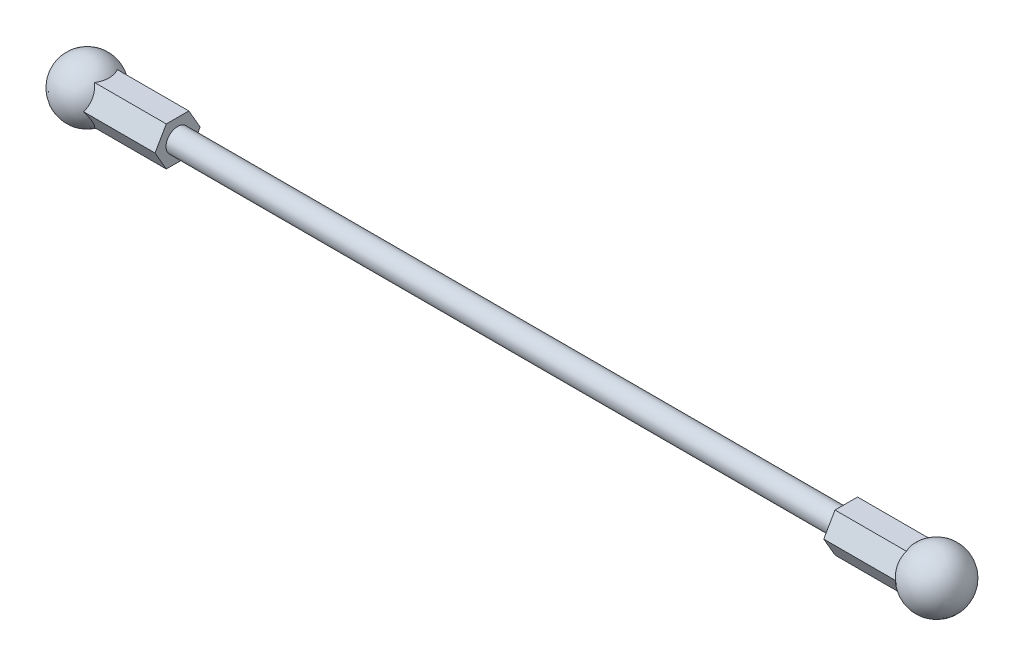
ISO-10303-21;
HEADER;
FILE_DESCRIPTION(('STEP AP214'),'2;1');
FILE_NAME('part.step','',(''),(''),'','','');
FILE_SCHEMA(('AUTOMOTIVE_DESIGN { 1 0 10303 214 1 1 1 1 }'));
ENDSEC;
DATA;
#1=APPLICATION_CONTEXT('core data for automotive mechanical design processes');
#2=APPLICATION_PROTOCOL_DEFINITION('international standard','automotive_design',2000,#1);
#3=PRODUCT_CONTEXT('',#1,'mechanical');
#4=PRODUCT('Part','Part','',(#3));
#5=PRODUCT_RELATED_PRODUCT_CATEGORY('part','',(#4));
#6=PRODUCT_DEFINITION_FORMATION('','',#4);
#7=PRODUCT_DEFINITION_CONTEXT('part definition',#1,'design');
#8=PRODUCT_DEFINITION('design','',#6,#7);
#9=PRODUCT_DEFINITION_SHAPE('','',#8);
#10=(LENGTH_UNIT() NAMED_UNIT(*) SI_UNIT(.MILLI.,.METRE.));
#11=(NAMED_UNIT(*) PLANE_ANGLE_UNIT() SI_UNIT($,.RADIAN.));
#12=(NAMED_UNIT(*) SI_UNIT($,.STERADIAN.) SOLID_ANGLE_UNIT());
#13=UNCERTAINTY_MEASURE_WITH_UNIT(LENGTH_MEASURE(1.E-05),#10,'distance_accuracy_value','');
#14=(GEOMETRIC_REPRESENTATION_CONTEXT(3) GLOBAL_UNCERTAINTY_ASSIGNED_CONTEXT((#13)) GLOBAL_UNIT_ASSIGNED_CONTEXT((#10,
#11,#12)) REPRESENTATION_CONTEXT('',''));
#15=CARTESIAN_POINT('',(0.,0.,0.));
#16=DIRECTION('',(0.,0.,1.));
#17=DIRECTION('',(1.,0.,0.));
#18=AXIS2_PLACEMENT_3D('',#15,#16,#17);
#19=CARTESIAN_POINT('',(77.75,2.,-1.15470053837925));
#20=DIRECTION('',(0.,-1.,0.));
#21=DIRECTION('',(0.,0.,-1.));
#22=AXIS2_PLACEMENT_3D('',#19,#20,#21);
#23=PLANE('',#22);
#24=DIRECTION('',(1.,0.,0.));
#25=VECTOR('',#24,1.);
#26=CARTESIAN_POINT('',(77.75,2.,-1.15470053837925));
#27=LINE('',#26,#25);
#28=CARTESIAN_POINT('',(77.75,2.,-1.15470053837925));
#29=VERTEX_POINT('',#28);
#30=CARTESIAN_POINT('',(85.0851457844873,2.,-1.15470053837925));
#31=VERTEX_POINT('',#30);
#32=EDGE_CURVE('E113',#29,#31,#27,.T.);
#33=ORIENTED_EDGE('',*,*,#32,.F.);
#34=DIRECTION('',(0.,0.,1.));
#35=VECTOR('',#34,1.);
#36=CARTESIAN_POINT('',(77.75,2.,-1.15470053837925));
#37=LINE('',#36,#35);
#38=CARTESIAN_POINT('',(77.75,2.,1.15470053837925));
#39=VERTEX_POINT('',#38);
#40=EDGE_CURVE('E103',#29,#39,#37,.T.);
#41=ORIENTED_EDGE('',*,*,#40,.T.);
#42=DIRECTION('',(1.,0.,0.));
#43=VECTOR('',#42,1.);
#44=CARTESIAN_POINT('',(77.75,2.,1.15470053837925));
#45=LINE('',#44,#43);
#46=CARTESIAN_POINT('',(85.0851457844873,2.,1.15470053837925));
#47=VERTEX_POINT('',#46);
#48=EDGE_CURVE('E67',#39,#47,#45,.T.);
#49=ORIENTED_EDGE('',*,*,#48,.T.);
#50=CARTESIAN_POINT('',(87.,2.,0.));
#51=DIRECTION('',(0.,1.,0.));
#52=DIRECTION('',(0.,0.,-1.));
#53=AXIS2_PLACEMENT_3D('',#50,#51,#52);
#54=CIRCLE('',#53,2.23606797749979);
#55=EDGE_CURVE('E12',#31,#47,#54,.T.);
#56=ORIENTED_EDGE('',*,*,#55,.F.);
#57=EDGE_LOOP('',(#33,#41,#49,#56));
#58=FACE_BOUND('',#57,.T.);
#59=ADVANCED_FACE('F49',(#58),#23,.F.);
#60=CARTESIAN_POINT('',(77.75,2.,1.15470053837925));
#61=DIRECTION('',(0.,-0.5,-0.866025403784439));
#62=DIRECTION('',(0.,0.866025403784439,-0.5));
#63=AXIS2_PLACEMENT_3D('',#60,#61,#62);
#64=PLANE('',#63);
#65=ORIENTED_EDGE('',*,*,#48,.F.);
#66=DIRECTION('',(0.,-0.866025403784438,0.5));
#67=VECTOR('',#66,1.);
#68=CARTESIAN_POINT('',(77.75,2.,1.15470053837925));
#69=LINE('',#68,#67);
#70=CARTESIAN_POINT('',(77.75,0.,2.3094010767585));
#71=VERTEX_POINT('',#70);
#72=EDGE_CURVE('E101',#39,#71,#69,.T.);
#73=ORIENTED_EDGE('',*,*,#72,.T.);
#74=DIRECTION('',(1.,0.,0.));
#75=VECTOR('',#74,1.);
#76=CARTESIAN_POINT('',(77.75,0.,2.3094010767585));
#77=LINE('',#76,#75);
#78=CARTESIAN_POINT('',(85.0851457844873,0.,2.3094010767585));
#79=VERTEX_POINT('',#78);
#80=EDGE_CURVE('E141',#71,#79,#77,.T.);
#81=ORIENTED_EDGE('',*,*,#80,.T.);
#82=CARTESIAN_POINT('',(87.,1.,1.73205080756888));
#83=DIRECTION('',(0.,0.5,0.866025403784439));
#84=DIRECTION('',(0.,0.866025403784439,-0.5));
#85=AXIS2_PLACEMENT_3D('',#82,#83,#84);
#86=CIRCLE('',#85,2.23606797749979);
#87=EDGE_CURVE('E57',#47,#79,#86,.T.);
#88=ORIENTED_EDGE('',*,*,#87,.F.);
#89=EDGE_LOOP('',(#65,#73,#81,#88));
#90=FACE_BOUND('',#89,.T.);
#91=ADVANCED_FACE('F109',(#90),#64,.F.);
#92=CARTESIAN_POINT('',(77.75,0.,2.3094010767585));
#93=DIRECTION('',(0.,0.5,-0.866025403784439));
#94=DIRECTION('',(0.,0.866025403784439,0.5));
#95=AXIS2_PLACEMENT_3D('',#92,#93,#94);
#96=PLANE('',#95);
#97=ORIENTED_EDGE('',*,*,#80,.F.);
#98=DIRECTION('',(0.,-0.866025403784439,-0.5));
#99=VECTOR('',#98,1.);
#100=CARTESIAN_POINT('',(77.75,0.,2.3094010767585));
#101=LINE('',#100,#99);
#102=CARTESIAN_POINT('',(77.75,-2.,1.15470053837925));
#103=VERTEX_POINT('',#102);
#104=EDGE_CURVE('E105',#71,#103,#101,.T.);
#105=ORIENTED_EDGE('',*,*,#104,.T.);
#106=DIRECTION('',(1.,0.,0.));
#107=VECTOR('',#106,1.);
#108=CARTESIAN_POINT('',(77.75,-2.,1.15470053837925));
#109=LINE('',#108,#107);
#110=CARTESIAN_POINT('',(85.0851457844873,-2.,1.15470053837925));
#111=VERTEX_POINT('',#110);
#112=EDGE_CURVE('E136',#103,#111,#109,.T.);
#113=ORIENTED_EDGE('',*,*,#112,.T.);
#114=CARTESIAN_POINT('',(87.,-1.,1.73205080756888));
#115=DIRECTION('',(0.,-0.5,0.866025403784439));
#116=DIRECTION('',(0.,0.866025403784439,0.5));
#117=AXIS2_PLACEMENT_3D('',#114,#115,#116);
#118=CIRCLE('',#117,2.23606797749979);
#119=EDGE_CURVE('E111',#79,#111,#118,.T.);
#120=ORIENTED_EDGE('',*,*,#119,.F.);
#121=EDGE_LOOP('',(#97,#105,#113,#120));
#122=FACE_BOUND('',#121,.T.);
#123=ADVANCED_FACE('F159',(#122),#96,.F.);
#124=CARTESIAN_POINT('',(77.75,-2.,1.15470053837925));
#125=DIRECTION('',(0.,1.,0.));
#126=DIRECTION('',(0.,0.,1.));
#127=AXIS2_PLACEMENT_3D('',#124,#125,#126);
#128=PLANE('',#127);
#129=ORIENTED_EDGE('',*,*,#112,.F.);
#130=DIRECTION('',(0.,0.,-1.));
#131=VECTOR('',#130,1.);
#132=CARTESIAN_POINT('',(77.75,-2.,1.15470053837925));
#133=LINE('',#132,#131);
#134=CARTESIAN_POINT('',(77.75,-2.,-1.15470053837925));
#135=VERTEX_POINT('',#134);
#136=EDGE_CURVE('E120',#103,#135,#133,.T.);
#137=ORIENTED_EDGE('',*,*,#136,.T.);
#138=DIRECTION('',(1.,0.,0.));
#139=VECTOR('',#138,1.);
#140=CARTESIAN_POINT('',(77.75,-2.,-1.15470053837925));
#141=LINE('',#140,#139);
#142=CARTESIAN_POINT('',(85.0851457844873,-2.,-1.15470053837925));
#143=VERTEX_POINT('',#142);
#144=EDGE_CURVE('E131',#135,#143,#141,.T.);
#145=ORIENTED_EDGE('',*,*,#144,.T.);
#146=CARTESIAN_POINT('',(87.,-2.,0.));
#147=DIRECTION('',(0.,-1.,0.));
#148=DIRECTION('',(0.,0.,1.));
#149=AXIS2_PLACEMENT_3D('',#146,#147,#148);
#150=CIRCLE('',#149,2.23606797749979);
#151=EDGE_CURVE('E138',#111,#143,#150,.T.);
#152=ORIENTED_EDGE('',*,*,#151,.F.);
#153=EDGE_LOOP('',(#129,#137,#145,#152));
#154=FACE_BOUND('',#153,.T.);
#155=ADVANCED_FACE('F157',(#154),#128,.F.);
#156=CARTESIAN_POINT('',(77.75,-2.,-1.15470053837925));
#157=DIRECTION('',(0.,0.5,0.866025403784439));
#158=DIRECTION('',(0.,-0.866025403784439,0.5));
#159=AXIS2_PLACEMENT_3D('',#156,#157,#158);
#160=PLANE('',#159);
#161=ORIENTED_EDGE('',*,*,#144,.F.);
#162=DIRECTION('',(0.,0.866025403784438,-0.5));
#163=VECTOR('',#162,1.);
#164=CARTESIAN_POINT('',(77.75,-2.,-1.15470053837925));
#165=LINE('',#164,#163);
#166=CARTESIAN_POINT('',(77.75,0.,-2.3094010767585));
#167=VERTEX_POINT('',#166);
#168=EDGE_CURVE('E123',#135,#167,#165,.T.);
#169=ORIENTED_EDGE('',*,*,#168,.T.);
#170=DIRECTION('',(1.,0.,0.));
#171=VECTOR('',#170,1.);
#172=CARTESIAN_POINT('',(77.75,0.,-2.3094010767585));
#173=LINE('',#172,#171);
#174=CARTESIAN_POINT('',(85.0851457844873,0.,-2.3094010767585));
#175=VERTEX_POINT('',#174);
#176=EDGE_CURVE('E128',#167,#175,#173,.T.);
#177=ORIENTED_EDGE('',*,*,#176,.T.);
#178=CARTESIAN_POINT('',(87.,-1.,-1.73205080756888));
#179=DIRECTION('',(0.,-0.5,-0.866025403784439));
#180=DIRECTION('',(0.,-0.866025403784439,0.5));
#181=AXIS2_PLACEMENT_3D('',#178,#179,#180);
#182=CIRCLE('',#181,2.23606797749979);
#183=EDGE_CURVE('E133',#143,#175,#182,.T.);
#184=ORIENTED_EDGE('',*,*,#183,.F.);
#185=EDGE_LOOP('',(#161,#169,#177,#184));
#186=FACE_BOUND('',#185,.T.);
#187=ADVANCED_FACE('F154',(#186),#160,.F.);
#188=CARTESIAN_POINT('',(77.75,0.,-2.3094010767585));
#189=DIRECTION('',(0.,-0.5,0.866025403784439));
#190=DIRECTION('',(0.,-0.866025403784439,-0.5));
#191=AXIS2_PLACEMENT_3D('',#188,#189,#190);
#192=PLANE('',#191);
#193=ORIENTED_EDGE('',*,*,#176,.F.);
#194=DIRECTION('',(0.,0.866025403784439,0.5));
#195=VECTOR('',#194,1.);
#196=CARTESIAN_POINT('',(77.75,0.,-2.3094010767585));
#197=LINE('',#196,#195);
#198=EDGE_CURVE('E126',#167,#29,#197,.T.);
#199=ORIENTED_EDGE('',*,*,#198,.T.);
#200=ORIENTED_EDGE('',*,*,#32,.T.);
#201=CARTESIAN_POINT('',(87.,1.,-1.73205080756888));
#202=DIRECTION('',(0.,0.5,-0.866025403784439));
#203=DIRECTION('',(0.,-0.866025403784439,-0.5));
#204=AXIS2_PLACEMENT_3D('',#201,#202,#203);
#205=CIRCLE('',#204,2.23606797749979);
#206=EDGE_CURVE('E114',#175,#31,#205,.T.);
#207=ORIENTED_EDGE('',*,*,#206,.F.);
#208=EDGE_LOOP('',(#193,#199,#200,#207));
#209=FACE_BOUND('',#208,.T.);
#210=ADVANCED_FACE('F150',(#209),#192,.F.);
#211=CARTESIAN_POINT('',(77.75,0.,0.));
#212=DIRECTION('',(-1.,0.,0.));
#213=DIRECTION('',(0.,0.,-1.));
#214=AXIS2_PLACEMENT_3D('',#211,#212,#213);
#215=PLANE('',#214);
#216=ORIENTED_EDGE('',*,*,#40,.F.);
#217=ORIENTED_EDGE('',*,*,#198,.F.);
#218=ORIENTED_EDGE('',*,*,#168,.F.);
#219=ORIENTED_EDGE('',*,*,#136,.F.);
#220=ORIENTED_EDGE('',*,*,#104,.F.);
#221=ORIENTED_EDGE('',*,*,#72,.F.);
#222=EDGE_LOOP('',(#216,#217,#218,#219,#220,#221));
#223=FACE_BOUND('',#222,.T.);
#224=ADVANCED_FACE('F102',(#223),#215,.T.);
#225=CARTESIAN_POINT('',(87.,0.,0.));
#226=DIRECTION('',(0.,1.,0.));
#227=DIRECTION('',(0.,0.,-1.));
#228=AXIS2_PLACEMENT_3D('',#225,#226,#227);
#229=SPHERICAL_SURFACE('',#228,3.);
#230=ORIENTED_EDGE('',*,*,#206,.T.);
#231=ORIENTED_EDGE('',*,*,#55,.T.);
#232=ORIENTED_EDGE('',*,*,#87,.T.);
#233=ORIENTED_EDGE('',*,*,#119,.T.);
#234=ORIENTED_EDGE('',*,*,#151,.T.);
#235=ORIENTED_EDGE('',*,*,#183,.T.);
#236=EDGE_LOOP('',(#230,#231,#232,#233,#234,#235));
#237=FACE_BOUND('',#236,.T.);
#238=ADVANCED_FACE('F51',(#237),#229,.T.);
#239=CLOSED_SHELL('',(#59,#91,#123,#155,#187,#210,#224,#238));
#240=MANIFOLD_SOLID_BREP('B2',#239);
#241=CARTESIAN_POINT('',(0.,0.,0.));
#242=DIRECTION('',(0.,1.,0.));
#243=DIRECTION('',(-1.,0.,0.));
#244=AXIS2_PLACEMENT_3D('',#241,#242,#243);
#245=SPHERICAL_SURFACE('',#244,3.);
#246=CARTESIAN_POINT('',(0.,2.,0.));
#247=DIRECTION('',(0.,-1.,0.));
#248=DIRECTION('',(0.,0.,-1.));
#249=AXIS2_PLACEMENT_3D('',#246,#247,#248);
#250=CIRCLE('',#249,2.23606797749979);
#251=CARTESIAN_POINT('',(1.91485421551268,2.,-1.15470053837925));
#252=VERTEX_POINT('',#251);
#253=CARTESIAN_POINT('',(1.91485421551268,2.,1.15470053837925));
#254=VERTEX_POINT('',#253);
#255=EDGE_CURVE('E47',#252,#254,#250,.T.);
#256=ORIENTED_EDGE('',*,*,#255,.F.);
#257=CARTESIAN_POINT('',(0.,1.,-1.73205080756888));
#258=DIRECTION('',(0.,-0.5,0.866025403784439));
#259=DIRECTION('',(0.,-0.866025403784439,-0.5));
#260=AXIS2_PLACEMENT_3D('',#257,#258,#259);
#261=CIRCLE('',#260,2.23606797749979);
#262=CARTESIAN_POINT('',(1.91485421551268,0.,-2.3094010767585));
#263=VERTEX_POINT('',#262);
#264=EDGE_CURVE('E295',#263,#252,#261,.T.);
#265=ORIENTED_EDGE('',*,*,#264,.F.);
#266=CARTESIAN_POINT('',(0.,-1.,-1.73205080756888));
#267=DIRECTION('',(0.,0.5,0.866025403784439));
#268=DIRECTION('',(0.,-0.866025403784439,0.5));
#269=AXIS2_PLACEMENT_3D('',#266,#267,#268);
#270=CIRCLE('',#269,2.23606797749979);
#271=CARTESIAN_POINT('',(1.91485421551268,-2.,-1.15470053837925));
#272=VERTEX_POINT('',#271);
#273=EDGE_CURVE('E298',#272,#263,#270,.T.);
#274=ORIENTED_EDGE('',*,*,#273,.F.);
#275=CARTESIAN_POINT('',(0.,-2.,0.));
#276=DIRECTION('',(0.,1.,0.));
#277=DIRECTION('',(0.,0.,1.));
#278=AXIS2_PLACEMENT_3D('',#275,#276,#277);
#279=CIRCLE('',#278,2.23606797749979);
#280=CARTESIAN_POINT('',(1.91485421551268,-2.,1.15470053837925));
#281=VERTEX_POINT('',#280);
#282=EDGE_CURVE('E306',#281,#272,#279,.T.);
#283=ORIENTED_EDGE('',*,*,#282,.F.);
#284=CARTESIAN_POINT('',(0.,-1.,1.73205080756888));
#285=DIRECTION('',(0.,0.5,-0.866025403784439));
#286=DIRECTION('',(0.,0.866025403784439,0.5));
#287=AXIS2_PLACEMENT_3D('',#284,#285,#286);
#288=CIRCLE('',#287,2.23606797749979);
#289=CARTESIAN_POINT('',(1.91485421551268,0.,2.3094010767585));
#290=VERTEX_POINT('',#289);
#291=EDGE_CURVE('E242',#290,#281,#288,.T.);
#292=ORIENTED_EDGE('',*,*,#291,.F.);
#293=CARTESIAN_POINT('',(0.,1.,1.73205080756888));
#294=DIRECTION('',(0.,-0.5,-0.866025403784439));
#295=DIRECTION('',(0.,0.866025403784439,-0.5));
#296=AXIS2_PLACEMENT_3D('',#293,#294,#295);
#297=CIRCLE('',#296,2.23606797749979);
#298=EDGE_CURVE('E232',#254,#290,#297,.T.);
#299=ORIENTED_EDGE('',*,*,#298,.F.);
#300=EDGE_LOOP('',(#256,#265,#274,#283,#292,#299));
#301=FACE_BOUND('',#300,.T.);
#302=ADVANCED_FACE('F225',(#301),#245,.T.);
#303=CARTESIAN_POINT('',(9.25,2.,-1.15470053837925));
#304=DIRECTION('',(0.,-1.,0.));
#305=DIRECTION('',(0.,0.,-1.));
#306=AXIS2_PLACEMENT_3D('',#303,#304,#305);
#307=PLANE('',#306);
#308=DIRECTION('',(-1.,0.,0.));
#309=VECTOR('',#308,1.);
#310=CARTESIAN_POINT('',(9.25,2.,-1.15470053837925));
#311=LINE('',#310,#309);
#312=CARTESIAN_POINT('',(9.25,2.,-1.15470053837925));
#313=VERTEX_POINT('',#312);
#314=EDGE_CURVE('E321',#313,#252,#311,.T.);
#315=ORIENTED_EDGE('',*,*,#314,.T.);
#316=ORIENTED_EDGE('',*,*,#255,.T.);
#317=DIRECTION('',(-1.,0.,0.));
#318=VECTOR('',#317,1.);
#319=CARTESIAN_POINT('',(9.25,2.,1.15470053837925));
#320=LINE('',#319,#318);
#321=CARTESIAN_POINT('',(9.25,2.,1.15470053837925));
#322=VERTEX_POINT('',#321);
#323=EDGE_CURVE('E277',#322,#254,#320,.T.);
#324=ORIENTED_EDGE('',*,*,#323,.F.);
#325=DIRECTION('',(0.,0.,1.));
#326=VECTOR('',#325,1.);
#327=CARTESIAN_POINT('',(9.25,2.,-1.15470053837925));
#328=LINE('',#327,#326);
#329=EDGE_CURVE('E283',#313,#322,#328,.T.);
#330=ORIENTED_EDGE('',*,*,#329,.F.);
#331=EDGE_LOOP('',(#315,#316,#324,#330));
#332=FACE_BOUND('',#331,.T.);
#333=ADVANCED_FACE('F294',(#332),#307,.F.);
#334=CARTESIAN_POINT('',(9.25,2.,1.15470053837925));
#335=DIRECTION('',(0.,-0.5,-0.866025403784439));
#336=DIRECTION('',(0.,0.866025403784439,-0.5));
#337=AXIS2_PLACEMENT_3D('',#334,#335,#336);
#338=PLANE('',#337);
#339=ORIENTED_EDGE('',*,*,#323,.T.);
#340=ORIENTED_EDGE('',*,*,#298,.T.);
#341=DIRECTION('',(-1.,0.,0.));
#342=VECTOR('',#341,1.);
#343=CARTESIAN_POINT('',(9.25,0.,2.3094010767585));
#344=LINE('',#343,#342);
#345=CARTESIAN_POINT('',(9.25,0.,2.3094010767585));
#346=VERTEX_POINT('',#345);
#347=EDGE_CURVE('E279',#346,#290,#344,.T.);
#348=ORIENTED_EDGE('',*,*,#347,.F.);
#349=DIRECTION('',(0.,-0.866025403784438,0.5));
#350=VECTOR('',#349,1.);
#351=CARTESIAN_POINT('',(9.25,2.,1.15470053837925));
#352=LINE('',#351,#350);
#353=EDGE_CURVE('E273',#322,#346,#352,.T.);
#354=ORIENTED_EDGE('',*,*,#353,.F.);
#355=EDGE_LOOP('',(#339,#340,#348,#354));
#356=FACE_BOUND('',#355,.T.);
#357=ADVANCED_FACE('F275',(#356),#338,.F.);
#358=CARTESIAN_POINT('',(9.25,0.,2.3094010767585));
#359=DIRECTION('',(0.,0.5,-0.866025403784439));
#360=DIRECTION('',(0.,0.866025403784439,0.5));
#361=AXIS2_PLACEMENT_3D('',#358,#359,#360);
#362=PLANE('',#361);
#363=ORIENTED_EDGE('',*,*,#347,.T.);
#364=ORIENTED_EDGE('',*,*,#291,.T.);
#365=DIRECTION('',(-1.,0.,0.));
#366=VECTOR('',#365,1.);
#367=CARTESIAN_POINT('',(9.25,-2.,1.15470053837925));
#368=LINE('',#367,#366);
#369=CARTESIAN_POINT('',(9.25,-2.,1.15470053837925));
#370=VERTEX_POINT('',#369);
#371=EDGE_CURVE('E300',#370,#281,#368,.T.);
#372=ORIENTED_EDGE('',*,*,#371,.F.);
#373=DIRECTION('',(0.,-0.866025403784439,-0.5));
#374=VECTOR('',#373,1.);
#375=CARTESIAN_POINT('',(9.25,0.,2.3094010767585));
#376=LINE('',#375,#374);
#377=EDGE_CURVE('E282',#346,#370,#376,.T.);
#378=ORIENTED_EDGE('',*,*,#377,.F.);
#379=EDGE_LOOP('',(#363,#364,#372,#378));
#380=FACE_BOUND('',#379,.T.);
#381=ADVANCED_FACE('F310',(#380),#362,.F.);
#382=CARTESIAN_POINT('',(9.25,-2.,1.15470053837925));
#383=DIRECTION('',(0.,1.,0.));
#384=DIRECTION('',(0.,0.,1.));
#385=AXIS2_PLACEMENT_3D('',#382,#383,#384);
#386=PLANE('',#385);
#387=ORIENTED_EDGE('',*,*,#371,.T.);
#388=ORIENTED_EDGE('',*,*,#282,.T.);
#389=DIRECTION('',(-1.,0.,0.));
#390=VECTOR('',#389,1.);
#391=CARTESIAN_POINT('',(9.25,-2.,-1.15470053837925));
#392=LINE('',#391,#390);
#393=CARTESIAN_POINT('',(9.25,-2.,-1.15470053837925));
#394=VERTEX_POINT('',#393);
#395=EDGE_CURVE('E326',#394,#272,#392,.T.);
#396=ORIENTED_EDGE('',*,*,#395,.F.);
#397=DIRECTION('',(0.,0.,-1.));
#398=VECTOR('',#397,1.);
#399=CARTESIAN_POINT('',(9.25,-2.,1.15470053837925));
#400=LINE('',#399,#398);
#401=EDGE_CURVE('E314',#370,#394,#400,.T.);
#402=ORIENTED_EDGE('',*,*,#401,.F.);
#403=EDGE_LOOP('',(#387,#388,#396,#402));
#404=FACE_BOUND('',#403,.T.);
#405=ADVANCED_FACE('F329',(#404),#386,.F.);
#406=CARTESIAN_POINT('',(9.25,-2.,-1.15470053837925));
#407=DIRECTION('',(0.,0.5,0.866025403784439));
#408=DIRECTION('',(0.,-0.866025403784439,0.5));
#409=AXIS2_PLACEMENT_3D('',#406,#407,#408);
#410=PLANE('',#409);
#411=ORIENTED_EDGE('',*,*,#395,.T.);
#412=ORIENTED_EDGE('',*,*,#273,.T.);
#413=DIRECTION('',(-1.,0.,0.));
#414=VECTOR('',#413,1.);
#415=CARTESIAN_POINT('',(9.25,0.,-2.3094010767585));
#416=LINE('',#415,#414);
#417=CARTESIAN_POINT('',(9.25,0.,-2.3094010767585));
#418=VERTEX_POINT('',#417);
#419=EDGE_CURVE('E323',#418,#263,#416,.T.);
#420=ORIENTED_EDGE('',*,*,#419,.F.);
#421=DIRECTION('',(0.,0.866025403784438,-0.5));
#422=VECTOR('',#421,1.);
#423=CARTESIAN_POINT('',(9.25,-2.,-1.15470053837925));
#424=LINE('',#423,#422);
#425=EDGE_CURVE('E316',#394,#418,#424,.T.);
#426=ORIENTED_EDGE('',*,*,#425,.F.);
#427=EDGE_LOOP('',(#411,#412,#420,#426));
#428=FACE_BOUND('',#427,.T.);
#429=ADVANCED_FACE('F334',(#428),#410,.F.);
#430=CARTESIAN_POINT('',(9.25,0.,-2.3094010767585));
#431=DIRECTION('',(0.,-0.5,0.866025403784439));
#432=DIRECTION('',(0.,-0.866025403784439,-0.5));
#433=AXIS2_PLACEMENT_3D('',#430,#431,#432);
#434=PLANE('',#433);
#435=ORIENTED_EDGE('',*,*,#419,.T.);
#436=ORIENTED_EDGE('',*,*,#264,.T.);
#437=ORIENTED_EDGE('',*,*,#314,.F.);
#438=DIRECTION('',(0.,0.866025403784439,0.5));
#439=VECTOR('',#438,1.);
#440=CARTESIAN_POINT('',(9.25,0.,-2.3094010767585));
#441=LINE('',#440,#439);
#442=EDGE_CURVE('E288',#418,#313,#441,.T.);
#443=ORIENTED_EDGE('',*,*,#442,.F.);
#444=EDGE_LOOP('',(#435,#436,#437,#443));
#445=FACE_BOUND('',#444,.T.);
#446=ADVANCED_FACE('F336',(#445),#434,.F.);
#447=CARTESIAN_POINT('',(9.25,0.,0.));
#448=DIRECTION('',(1.,0.,0.));
#449=DIRECTION('',(0.,0.,-1.));
#450=AXIS2_PLACEMENT_3D('',#447,#448,#449);
#451=PLANE('',#450);
#452=CARTESIAN_POINT('',(9.25,0.,-0.00793613059507685));
#453=DIRECTION('',(1.,0.,0.));
#454=DIRECTION('',(0.,0.,-1.));
#455=AXIS2_PLACEMENT_3D('',#452,#453,#454);
#456=CIRCLE('',#455,1.190625);
#457=CARTESIAN_POINT('',(9.25,0.,-1.19856113059508));
#458=VERTEX_POINT('',#457);
#459=EDGE_CURVE('E368',#458,#458,#456,.T.);
#460=ORIENTED_EDGE('',*,*,#459,.F.);
#461=EDGE_LOOP('',(#460));
#462=FACE_BOUND('',#461,.T.);
#463=ORIENTED_EDGE('',*,*,#329,.T.);
#464=ORIENTED_EDGE('',*,*,#353,.T.);
#465=ORIENTED_EDGE('',*,*,#377,.T.);
#466=ORIENTED_EDGE('',*,*,#401,.T.);
#467=ORIENTED_EDGE('',*,*,#425,.T.);
#468=ORIENTED_EDGE('',*,*,#442,.T.);
#469=EDGE_LOOP('',(#463,#464,#465,#466,#467,#468));
#470=FACE_BOUND('',#469,.T.);
#471=ADVANCED_FACE('F286',(#462,#470),#451,.T.);
#472=CARTESIAN_POINT('',(81.1175960454009,0.,-0.00793613059507685));
#473=DIRECTION('',(-1.,0.,0.));
#474=DIRECTION('',(0.,0.,1.));
#475=AXIS2_PLACEMENT_3D('',#472,#473,#474);
#476=CYLINDRICAL_SURFACE('',#475,1.190625);
#477=CARTESIAN_POINT('',(77.75,0.,-0.00793613059507685));
#478=DIRECTION('',(-1.,0.,0.));
#479=DIRECTION('',(0.,0.,1.));
#480=AXIS2_PLACEMENT_3D('',#477,#478,#479);
#481=CIRCLE('',#480,1.190625);
#482=CARTESIAN_POINT('',(77.75,0.,1.18268886940492));
#483=VERTEX_POINT('',#482);
#484=EDGE_CURVE('E292',#483,#483,#481,.T.);
#485=ORIENTED_EDGE('',*,*,#484,.T.);
#486=EDGE_LOOP('',(#485));
#487=FACE_BOUND('',#486,.T.);
#488=ORIENTED_EDGE('',*,*,#459,.T.);
#489=EDGE_LOOP('',(#488));
#490=FACE_BOUND('',#489,.T.);
#491=ADVANCED_FACE('F356',(#487,#490),#476,.T.);
#492=CARTESIAN_POINT('',(77.75,0.,0.));
#493=DIRECTION('',(-1.,0.,0.));
#494=DIRECTION('',(0.,0.,-1.));
#495=AXIS2_PLACEMENT_3D('',#492,#493,#494);
#496=PLANE('',#495);
#497=ORIENTED_EDGE('',*,*,#484,.F.);
#498=EDGE_LOOP('',(#497));
#499=FACE_BOUND('',#498,.T.);
#500=ADVANCED_FACE('F360',(#499),#496,.F.);
#501=CLOSED_SHELL('',(#302,#333,#357,#381,#405,#429,#446,#471,#491,#500));
#502=MANIFOLD_SOLID_BREP('B6',#501);
#503=ADVANCED_BREP_SHAPE_REPRESENTATION('',(#18,#240,#502),#14);
#504=SHAPE_DEFINITION_REPRESENTATION(#9,#503);
ENDSEC;
END-ISO-10303-21;
